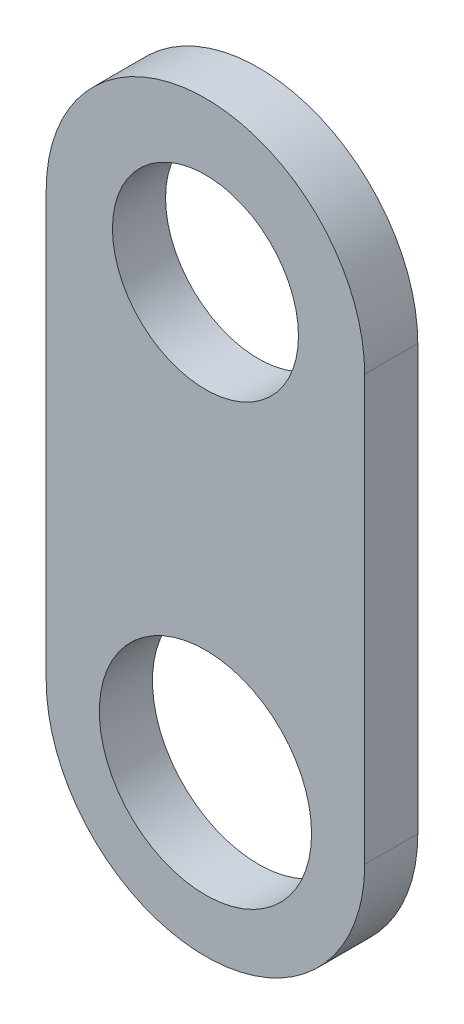
ISO-10303-21;
HEADER;
FILE_DESCRIPTION(('STEP AP214'),'2;1');
FILE_NAME('part.step','',(''),(''),'','','');
FILE_SCHEMA(('AUTOMOTIVE_DESIGN { 1 0 10303 214 1 1 1 1 }'));
ENDSEC;
DATA;
#1=APPLICATION_CONTEXT('core data for automotive mechanical design processes');
#2=APPLICATION_PROTOCOL_DEFINITION('international standard','automotive_design',2000,#1);
#3=PRODUCT_CONTEXT('',#1,'mechanical');
#4=PRODUCT('Part','Part','',(#3));
#5=PRODUCT_RELATED_PRODUCT_CATEGORY('part','',(#4));
#6=PRODUCT_DEFINITION_FORMATION('','',#4);
#7=PRODUCT_DEFINITION_CONTEXT('part definition',#1,'design');
#8=PRODUCT_DEFINITION('design','',#6,#7);
#9=PRODUCT_DEFINITION_SHAPE('','',#8);
#10=(LENGTH_UNIT() NAMED_UNIT(*) SI_UNIT(.MILLI.,.METRE.));
#11=(NAMED_UNIT(*) PLANE_ANGLE_UNIT() SI_UNIT($,.RADIAN.));
#12=(NAMED_UNIT(*) SI_UNIT($,.STERADIAN.) SOLID_ANGLE_UNIT());
#13=UNCERTAINTY_MEASURE_WITH_UNIT(LENGTH_MEASURE(1.E-05),#10,'distance_accuracy_value','');
#14=(GEOMETRIC_REPRESENTATION_CONTEXT(3) GLOBAL_UNCERTAINTY_ASSIGNED_CONTEXT((#13)) GLOBAL_UNIT_ASSIGNED_CONTEXT((#10,
#11,#12)) REPRESENTATION_CONTEXT('',''));
#15=CARTESIAN_POINT('',(0.,0.,0.));
#16=DIRECTION('',(0.,0.,1.));
#17=DIRECTION('',(1.,0.,0.));
#18=AXIS2_PLACEMENT_3D('',#15,#16,#17);
#19=CARTESIAN_POINT('',(0.,0.,3.175));
#20=DIRECTION('',(0.,0.,1.));
#21=DIRECTION('',(1.,0.,0.));
#22=AXIS2_PLACEMENT_3D('',#19,#20,#21);
#23=PLANE('',#22);
#24=CARTESIAN_POINT('',(0.,50.8,3.175));
#25=DIRECTION('',(0.,0.,1.));
#26=DIRECTION('',(1.,0.,0.));
#27=AXIS2_PLACEMENT_3D('',#24,#25,#26);
#28=CIRCLE('',#27,11.1252);
#29=CARTESIAN_POINT('',(11.1252,50.8,3.175));
#30=VERTEX_POINT('',#29);
#31=EDGE_CURVE('E116',#30,#30,#28,.T.);
#32=ORIENTED_EDGE('',*,*,#31,.F.);
#33=EDGE_LOOP('',(#32));
#34=FACE_BOUND('',#33,.T.);
#35=CARTESIAN_POINT('',(0.,0.,3.175));
#36=DIRECTION('',(0.,0.,1.));
#37=DIRECTION('',(1.,0.,0.));
#38=AXIS2_PLACEMENT_3D('',#35,#36,#37);
#39=CIRCLE('',#38,19.05);
#40=CARTESIAN_POINT('',(-19.05,0.,3.175));
#41=VERTEX_POINT('',#40);
#42=CARTESIAN_POINT('',(19.05,0.,3.175));
#43=VERTEX_POINT('',#42);
#44=EDGE_CURVE('E99',#41,#43,#39,.T.);
#45=ORIENTED_EDGE('',*,*,#44,.T.);
#46=DIRECTION('',(0.,1.,0.));
#47=VECTOR('',#46,1.);
#48=CARTESIAN_POINT('',(19.05,0.,3.175));
#49=LINE('',#48,#47);
#50=CARTESIAN_POINT('',(19.05,50.8,3.175));
#51=VERTEX_POINT('',#50);
#52=EDGE_CURVE('E94',#43,#51,#49,.T.);
#53=ORIENTED_EDGE('',*,*,#52,.T.);
#54=CARTESIAN_POINT('',(0.,50.8,3.175));
#55=DIRECTION('',(0.,0.,1.));
#56=DIRECTION('',(1.,0.,0.));
#57=AXIS2_PLACEMENT_3D('',#54,#55,#56);
#58=CIRCLE('',#57,19.05);
#59=CARTESIAN_POINT('',(-19.05,50.8,3.175));
#60=VERTEX_POINT('',#59);
#61=EDGE_CURVE('E97',#51,#60,#58,.T.);
#62=ORIENTED_EDGE('',*,*,#61,.T.);
#63=DIRECTION('',(0.,-1.,0.));
#64=VECTOR('',#63,1.);
#65=CARTESIAN_POINT('',(-19.05,0.,3.175));
#66=LINE('',#65,#64);
#67=EDGE_CURVE('E61',#60,#41,#66,.T.);
#68=ORIENTED_EDGE('',*,*,#67,.T.);
#69=EDGE_LOOP('',(#45,#53,#62,#68));
#70=FACE_BOUND('',#69,.T.);
#71=CARTESIAN_POINT('',(0.,0.,3.175));
#72=DIRECTION('',(0.,0.,1.));
#73=DIRECTION('',(1.,0.,0.));
#74=AXIS2_PLACEMENT_3D('',#71,#72,#73);
#75=CIRCLE('',#74,12.69365);
#76=CARTESIAN_POINT('',(12.69365,0.,3.175));
#77=VERTEX_POINT('',#76);
#78=EDGE_CURVE('E145',#77,#77,#75,.T.);
#79=ORIENTED_EDGE('',*,*,#78,.F.);
#80=EDGE_LOOP('',(#79));
#81=FACE_BOUND('',#80,.T.);
#82=ADVANCED_FACE('F50',(#34,#70,#81),#23,.T.);
#83=CARTESIAN_POINT('',(0.,0.,-3.175));
#84=DIRECTION('',(0.,0.,1.));
#85=DIRECTION('',(1.,0.,0.));
#86=AXIS2_PLACEMENT_3D('',#83,#84,#85);
#87=PLANE('',#86);
#88=CARTESIAN_POINT('',(0.,0.,-3.175));
#89=DIRECTION('',(0.,0.,1.));
#90=DIRECTION('',(1.,0.,0.));
#91=AXIS2_PLACEMENT_3D('',#88,#89,#90);
#92=CIRCLE('',#91,19.05);
#93=CARTESIAN_POINT('',(-19.05,0.,-3.175));
#94=VERTEX_POINT('',#93);
#95=CARTESIAN_POINT('',(19.05,0.,-3.175));
#96=VERTEX_POINT('',#95);
#97=EDGE_CURVE('E118',#94,#96,#92,.T.);
#98=ORIENTED_EDGE('',*,*,#97,.F.);
#99=DIRECTION('',(0.,-1.,0.));
#100=VECTOR('',#99,1.);
#101=CARTESIAN_POINT('',(-19.05,0.,-3.175));
#102=LINE('',#101,#100);
#103=CARTESIAN_POINT('',(-19.05,50.8,-3.175));
#104=VERTEX_POINT('',#103);
#105=EDGE_CURVE('E88',#104,#94,#102,.T.);
#106=ORIENTED_EDGE('',*,*,#105,.F.);
#107=CARTESIAN_POINT('',(0.,50.8,-3.175));
#108=DIRECTION('',(0.,0.,1.));
#109=DIRECTION('',(1.,0.,0.));
#110=AXIS2_PLACEMENT_3D('',#107,#108,#109);
#111=CIRCLE('',#110,19.05);
#112=CARTESIAN_POINT('',(19.05,50.8,-3.175));
#113=VERTEX_POINT('',#112);
#114=EDGE_CURVE('E85',#113,#104,#111,.T.);
#115=ORIENTED_EDGE('',*,*,#114,.F.);
#116=DIRECTION('',(0.,1.,0.));
#117=VECTOR('',#116,1.);
#118=CARTESIAN_POINT('',(19.05,0.,-3.175));
#119=LINE('',#118,#117);
#120=EDGE_CURVE('E101',#96,#113,#119,.T.);
#121=ORIENTED_EDGE('',*,*,#120,.F.);
#122=EDGE_LOOP('',(#98,#106,#115,#121));
#123=FACE_BOUND('',#122,.T.);
#124=CARTESIAN_POINT('',(0.,50.8,-3.175));
#125=DIRECTION('',(0.,0.,1.));
#126=DIRECTION('',(1.,0.,0.));
#127=AXIS2_PLACEMENT_3D('',#124,#125,#126);
#128=CIRCLE('',#127,11.1252);
#129=CARTESIAN_POINT('',(11.1252,50.8,-3.175));
#130=VERTEX_POINT('',#129);
#131=EDGE_CURVE('E138',#130,#130,#128,.T.);
#132=ORIENTED_EDGE('',*,*,#131,.T.);
#133=EDGE_LOOP('',(#132));
#134=FACE_BOUND('',#133,.T.);
#135=CARTESIAN_POINT('',(0.,0.,-3.175));
#136=DIRECTION('',(0.,0.,1.));
#137=DIRECTION('',(1.,0.,0.));
#138=AXIS2_PLACEMENT_3D('',#135,#136,#137);
#139=CIRCLE('',#138,12.69365);
#140=CARTESIAN_POINT('',(12.69365,0.,-3.175));
#141=VERTEX_POINT('',#140);
#142=EDGE_CURVE('E147',#141,#141,#139,.T.);
#143=ORIENTED_EDGE('',*,*,#142,.T.);
#144=EDGE_LOOP('',(#143));
#145=FACE_BOUND('',#144,.T.);
#146=ADVANCED_FACE('F133',(#123,#134,#145),#87,.F.);
#147=CARTESIAN_POINT('',(0.,0.,3.175));
#148=DIRECTION('',(0.,0.,-1.));
#149=DIRECTION('',(-1.,0.,0.));
#150=AXIS2_PLACEMENT_3D('',#147,#148,#149);
#151=CYLINDRICAL_SURFACE('',#150,19.05);
#152=ORIENTED_EDGE('',*,*,#97,.T.);
#153=DIRECTION('',(0.,0.,-1.));
#154=VECTOR('',#153,1.);
#155=CARTESIAN_POINT('',(19.05,0.,3.175));
#156=LINE('',#155,#154);
#157=EDGE_CURVE('E12',#43,#96,#156,.T.);
#158=ORIENTED_EDGE('',*,*,#157,.F.);
#159=ORIENTED_EDGE('',*,*,#44,.F.);
#160=DIRECTION('',(0.,0.,-1.));
#161=VECTOR('',#160,1.);
#162=CARTESIAN_POINT('',(-19.05,0.,3.175));
#163=LINE('',#162,#161);
#164=EDGE_CURVE('E112',#41,#94,#163,.T.);
#165=ORIENTED_EDGE('',*,*,#164,.T.);
#166=EDGE_LOOP('',(#152,#158,#159,#165));
#167=FACE_BOUND('',#166,.T.);
#168=ADVANCED_FACE('F47',(#167),#151,.T.);
#169=CARTESIAN_POINT('',(19.05,0.,3.175));
#170=DIRECTION('',(-1.,0.,0.));
#171=DIRECTION('',(0.,0.,1.));
#172=AXIS2_PLACEMENT_3D('',#169,#170,#171);
#173=PLANE('',#172);
#174=ORIENTED_EDGE('',*,*,#120,.T.);
#175=DIRECTION('',(0.,0.,-1.));
#176=VECTOR('',#175,1.);
#177=CARTESIAN_POINT('',(19.05,50.8,3.175));
#178=LINE('',#177,#176);
#179=EDGE_CURVE('E60',#51,#113,#178,.T.);
#180=ORIENTED_EDGE('',*,*,#179,.F.);
#181=ORIENTED_EDGE('',*,*,#52,.F.);
#182=ORIENTED_EDGE('',*,*,#157,.T.);
#183=EDGE_LOOP('',(#174,#180,#181,#182));
#184=FACE_BOUND('',#183,.T.);
#185=ADVANCED_FACE('F104',(#184),#173,.F.);
#186=CARTESIAN_POINT('',(0.,50.8,3.175));
#187=DIRECTION('',(0.,0.,-1.));
#188=DIRECTION('',(-1.,0.,0.));
#189=AXIS2_PLACEMENT_3D('',#186,#187,#188);
#190=CYLINDRICAL_SURFACE('',#189,19.05);
#191=ORIENTED_EDGE('',*,*,#114,.T.);
#192=DIRECTION('',(0.,0.,-1.));
#193=VECTOR('',#192,1.);
#194=CARTESIAN_POINT('',(-19.05,50.8,3.175));
#195=LINE('',#194,#193);
#196=EDGE_CURVE('E108',#60,#104,#195,.T.);
#197=ORIENTED_EDGE('',*,*,#196,.F.);
#198=ORIENTED_EDGE('',*,*,#61,.F.);
#199=ORIENTED_EDGE('',*,*,#179,.T.);
#200=EDGE_LOOP('',(#191,#197,#198,#199));
#201=FACE_BOUND('',#200,.T.);
#202=ADVANCED_FACE('F109',(#201),#190,.T.);
#203=CARTESIAN_POINT('',(-19.05,0.,3.175));
#204=DIRECTION('',(1.,0.,0.));
#205=DIRECTION('',(0.,0.,-1.));
#206=AXIS2_PLACEMENT_3D('',#203,#204,#205);
#207=PLANE('',#206);
#208=ORIENTED_EDGE('',*,*,#105,.T.);
#209=ORIENTED_EDGE('',*,*,#164,.F.);
#210=ORIENTED_EDGE('',*,*,#67,.F.);
#211=ORIENTED_EDGE('',*,*,#196,.T.);
#212=EDGE_LOOP('',(#208,#209,#210,#211));
#213=FACE_BOUND('',#212,.T.);
#214=ADVANCED_FACE('F127',(#213),#207,.F.);
#215=CARTESIAN_POINT('',(0.,50.8,3.175));
#216=DIRECTION('',(0.,0.,-1.));
#217=DIRECTION('',(-1.,0.,0.));
#218=AXIS2_PLACEMENT_3D('',#215,#216,#217);
#219=CYLINDRICAL_SURFACE('',#218,11.1252);
#220=ORIENTED_EDGE('',*,*,#31,.T.);
#221=EDGE_LOOP('',(#220));
#222=FACE_BOUND('',#221,.T.);
#223=ORIENTED_EDGE('',*,*,#131,.F.);
#224=EDGE_LOOP('',(#223));
#225=FACE_BOUND('',#224,.T.);
#226=ADVANCED_FACE('F161',(#222,#225),#219,.F.);
#227=CARTESIAN_POINT('',(0.,0.,3.175));
#228=DIRECTION('',(0.,0.,-1.));
#229=DIRECTION('',(-1.,0.,0.));
#230=AXIS2_PLACEMENT_3D('',#227,#228,#229);
#231=CYLINDRICAL_SURFACE('',#230,12.69365);
#232=ORIENTED_EDGE('',*,*,#78,.T.);
#233=EDGE_LOOP('',(#232));
#234=FACE_BOUND('',#233,.T.);
#235=ORIENTED_EDGE('',*,*,#142,.F.);
#236=EDGE_LOOP('',(#235));
#237=FACE_BOUND('',#236,.T.);
#238=ADVANCED_FACE('F155',(#234,#237),#231,.F.);
#239=CLOSED_SHELL('',(#82,#146,#168,#185,#202,#214,#226,#238));
#240=MANIFOLD_SOLID_BREP('B2',#239);
#241=ADVANCED_BREP_SHAPE_REPRESENTATION('',(#18,#240),#14);
#242=SHAPE_DEFINITION_REPRESENTATION(#9,#241);
ENDSEC;
END-ISO-10303-21;
